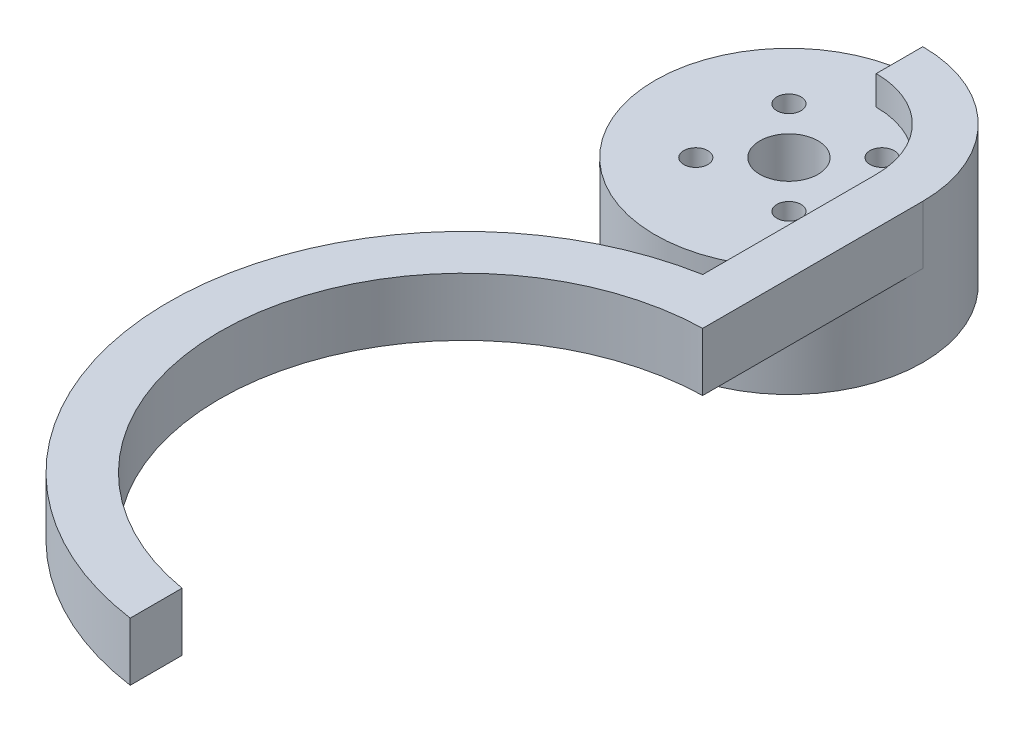
ISO-10303-21;
HEADER;
FILE_DESCRIPTION(('STEP AP214'),'2;1');
FILE_NAME('part.step','',(''),(''),'','','');
FILE_SCHEMA(('AUTOMOTIVE_DESIGN { 1 0 10303 214 1 1 1 1 }'));
ENDSEC;
DATA;
#1=APPLICATION_CONTEXT('core data for automotive mechanical design processes');
#2=APPLICATION_PROTOCOL_DEFINITION('international standard','automotive_design',2000,#1);
#3=PRODUCT_CONTEXT('',#1,'mechanical');
#4=PRODUCT('Part','Part','',(#3));
#5=PRODUCT_RELATED_PRODUCT_CATEGORY('part','',(#4));
#6=PRODUCT_DEFINITION_FORMATION('','',#4);
#7=PRODUCT_DEFINITION_CONTEXT('part definition',#1,'design');
#8=PRODUCT_DEFINITION('design','',#6,#7);
#9=PRODUCT_DEFINITION_SHAPE('','',#8);
#10=(LENGTH_UNIT() NAMED_UNIT(*) SI_UNIT(.MILLI.,.METRE.));
#11=(NAMED_UNIT(*) PLANE_ANGLE_UNIT() SI_UNIT($,.RADIAN.));
#12=(NAMED_UNIT(*) SI_UNIT($,.STERADIAN.) SOLID_ANGLE_UNIT());
#13=UNCERTAINTY_MEASURE_WITH_UNIT(LENGTH_MEASURE(1.E-05),#10,'distance_accuracy_value','');
#14=(GEOMETRIC_REPRESENTATION_CONTEXT(3) GLOBAL_UNCERTAINTY_ASSIGNED_CONTEXT((#13)) GLOBAL_UNIT_ASSIGNED_CONTEXT((#10,
#11,#12)) REPRESENTATION_CONTEXT('',''));
#15=CARTESIAN_POINT('',(0.,0.,0.));
#16=DIRECTION('',(0.,0.,1.));
#17=DIRECTION('',(1.,0.,0.));
#18=AXIS2_PLACEMENT_3D('',#15,#16,#17);
#19=CARTESIAN_POINT('',(0.,0.,0.));
#20=DIRECTION('',(0.,1.,0.));
#21=DIRECTION('',(0.,0.,-1.));
#22=AXIS2_PLACEMENT_3D('',#19,#20,#21);
#23=PLANE('',#22);
#24=CARTESIAN_POINT('',(0.,0.,0.));
#25=DIRECTION('',(0.,-1.,0.));
#26=DIRECTION('',(0.,0.,-1.));
#27=AXIS2_PLACEMENT_3D('',#24,#25,#26);
#28=CIRCLE('',#27,23.);
#29=CARTESIAN_POINT('',(23.,0.,0.));
#30=VERTEX_POINT('',#29);
#31=CARTESIAN_POINT('',(15.,0.,17.4355957741627));
#32=VERTEX_POINT('',#31);
#33=EDGE_CURVE('E114',#30,#32,#28,.T.);
#34=ORIENTED_EDGE('',*,*,#33,.F.);
#35=DIRECTION('',(0.,0.,1.));
#36=VECTOR('',#35,1.);
#37=CARTESIAN_POINT('',(23.,0.,0.));
#38=LINE('',#37,#36);
#39=CARTESIAN_POINT('',(23.,0.,37.811906449566));
#40=VERTEX_POINT('',#39);
#41=EDGE_CURVE('E123',#30,#40,#38,.T.);
#42=ORIENTED_EDGE('',*,*,#41,.T.);
#43=CARTESIAN_POINT('',(24.,0.,79.8));
#44=DIRECTION('',(0.,-1.,0.));
#45=DIRECTION('',(0.,0.,-1.));
#46=AXIS2_PLACEMENT_3D('',#43,#44,#45);
#47=CIRCLE('',#46,42.);
#48=CARTESIAN_POINT('',(16.9372197309417,0.,121.201897720648));
#49=VERTEX_POINT('',#48);
#50=EDGE_CURVE('E128',#49,#40,#47,.T.);
#51=ORIENTED_EDGE('',*,*,#50,.F.);
#52=DIRECTION('',(0.,0.,1.));
#53=VECTOR('',#52,1.);
#54=CARTESIAN_POINT('',(16.9372197309417,0.,0.));
#55=LINE('',#54,#53);
#56=CARTESIAN_POINT('',(16.9372197309417,0.,130.106631122259));
#57=VERTEX_POINT('',#56);
#58=EDGE_CURVE('E194',#49,#57,#55,.T.);
#59=ORIENTED_EDGE('',*,*,#58,.T.);
#60=CARTESIAN_POINT('',(24.,0.,79.8));
#61=DIRECTION('',(0.,-1.,0.));
#62=DIRECTION('',(0.,0.,-1.));
#63=AXIS2_PLACEMENT_3D('',#60,#61,#62);
#64=CIRCLE('',#63,50.8);
#65=CARTESIAN_POINT('',(15.,0.,29.8036001296093));
#66=VERTEX_POINT('',#65);
#67=EDGE_CURVE('E176',#57,#66,#64,.T.);
#68=ORIENTED_EDGE('',*,*,#67,.T.);
#69=DIRECTION('',(0.,0.,1.));
#70=VECTOR('',#69,1.);
#71=CARTESIAN_POINT('',(15.,0.,0.));
#72=LINE('',#71,#70);
#73=EDGE_CURVE('E129',#32,#66,#72,.T.);
#74=ORIENTED_EDGE('',*,*,#73,.F.);
#75=EDGE_LOOP('',(#34,#42,#51,#59,#68,#74));
#76=FACE_BOUND('',#75,.T.);
#77=ADVANCED_FACE('F37',(#76),#23,.F.);
#78=CARTESIAN_POINT('',(15.,5.,0.));
#79=DIRECTION('',(-1.,0.,0.));
#80=DIRECTION('',(0.,0.,-1.));
#81=AXIS2_PLACEMENT_3D('',#78,#79,#80);
#82=PLANE('',#81);
#83=ORIENTED_EDGE('',*,*,#73,.T.);
#84=DIRECTION('',(0.,-1.,0.));
#85=VECTOR('',#84,1.);
#86=CARTESIAN_POINT('',(15.,5.,29.8036001296093));
#87=LINE('',#86,#85);
#88=CARTESIAN_POINT('',(15.,10.,29.8036001296093));
#89=VERTEX_POINT('',#88);
#90=EDGE_CURVE('E191',#89,#66,#87,.T.);
#91=ORIENTED_EDGE('',*,*,#90,.F.);
#92=DIRECTION('',(0.,0.,1.));
#93=VECTOR('',#92,1.);
#94=CARTESIAN_POINT('',(15.,10.,0.));
#95=LINE('',#94,#93);
#96=CARTESIAN_POINT('',(15.,10.,0.));
#97=VERTEX_POINT('',#96);
#98=EDGE_CURVE('E150',#97,#89,#95,.T.);
#99=ORIENTED_EDGE('',*,*,#98,.F.);
#100=DIRECTION('',(0.,-1.,0.));
#101=VECTOR('',#100,1.);
#102=CARTESIAN_POINT('',(15.,10.,0.));
#103=LINE('',#102,#101);
#104=CARTESIAN_POINT('',(15.,5.,0.));
#105=VERTEX_POINT('',#104);
#106=EDGE_CURVE('E164',#97,#105,#103,.T.);
#107=ORIENTED_EDGE('',*,*,#106,.T.);
#108=DIRECTION('',(0.,0.,-1.));
#109=VECTOR('',#108,1.);
#110=CARTESIAN_POINT('',(15.,5.,0.));
#111=LINE('',#110,#109);
#112=CARTESIAN_POINT('',(15.,5.,17.4355957741627));
#113=VERTEX_POINT('',#112);
#114=EDGE_CURVE('E170',#113,#105,#111,.T.);
#115=ORIENTED_EDGE('',*,*,#114,.F.);
#116=DIRECTION('',(0.,-1.,0.));
#117=VECTOR('',#116,1.);
#118=CARTESIAN_POINT('',(15.,5.,17.4355957741627));
#119=LINE('',#118,#117);
#120=EDGE_CURVE('E11',#113,#32,#119,.T.);
#121=ORIENTED_EDGE('',*,*,#120,.T.);
#122=EDGE_LOOP('',(#83,#91,#99,#107,#115,#121));
#123=FACE_BOUND('',#122,.T.);
#124=ADVANCED_FACE('F39',(#123),#82,.T.);
#125=CARTESIAN_POINT('',(0.,5.,0.));
#126=DIRECTION('',(0.,-1.,0.));
#127=DIRECTION('',(0.,0.,1.));
#128=AXIS2_PLACEMENT_3D('',#125,#126,#127);
#129=CYLINDRICAL_SURFACE('',#128,23.);
#130=DIRECTION('',(0.,-1.,0.));
#131=VECTOR('',#130,1.);
#132=CARTESIAN_POINT('',(23.,5.,0.));
#133=LINE('',#132,#131);
#134=CARTESIAN_POINT('',(23.,10.,0.));
#135=VERTEX_POINT('',#134);
#136=EDGE_CURVE('E45',#135,#30,#133,.T.);
#137=ORIENTED_EDGE('',*,*,#136,.T.);
#138=ORIENTED_EDGE('',*,*,#33,.T.);
#139=ORIENTED_EDGE('',*,*,#120,.F.);
#140=CARTESIAN_POINT('',(0.,5.,0.));
#141=DIRECTION('',(0.,-1.,0.));
#142=DIRECTION('',(0.,0.,-1.));
#143=AXIS2_PLACEMENT_3D('',#140,#141,#142);
#144=CIRCLE('',#143,23.);
#145=CARTESIAN_POINT('',(0.,5.,-23.));
#146=VERTEX_POINT('',#145);
#147=EDGE_CURVE('E172',#113,#146,#144,.T.);
#148=ORIENTED_EDGE('',*,*,#147,.T.);
#149=DIRECTION('',(0.,-1.,0.));
#150=VECTOR('',#149,1.);
#151=CARTESIAN_POINT('',(0.,10.,-23.));
#152=LINE('',#151,#150);
#153=CARTESIAN_POINT('',(0.,10.,-23.));
#154=VERTEX_POINT('',#153);
#155=EDGE_CURVE('E160',#154,#146,#152,.T.);
#156=ORIENTED_EDGE('',*,*,#155,.F.);
#157=CARTESIAN_POINT('',(0.,10.,0.));
#158=DIRECTION('',(0.,-1.,0.));
#159=DIRECTION('',(0.,0.,-1.));
#160=AXIS2_PLACEMENT_3D('',#157,#158,#159);
#161=CIRCLE('',#160,23.);
#162=EDGE_CURVE('E117',#154,#135,#161,.T.);
#163=ORIENTED_EDGE('',*,*,#162,.T.);
#164=EDGE_LOOP('',(#137,#138,#139,#148,#156,#163));
#165=FACE_BOUND('',#164,.T.);
#166=CARTESIAN_POINT('',(0.,-14.,0.));
#167=DIRECTION('',(0.,-1.,0.));
#168=DIRECTION('',(0.,0.,-1.));
#169=AXIS2_PLACEMENT_3D('',#166,#167,#168);
#170=CIRCLE('',#169,23.);
#171=CARTESIAN_POINT('',(0.,-14.,-23.));
#172=VERTEX_POINT('',#171);
#173=EDGE_CURVE('E133',#172,#172,#170,.T.);
#174=ORIENTED_EDGE('',*,*,#173,.F.);
#175=EDGE_LOOP('',(#174));
#176=FACE_BOUND('',#175,.T.);
#177=ADVANCED_FACE('F110',(#165,#176),#129,.T.);
#178=CARTESIAN_POINT('',(23.,5.,0.));
#179=DIRECTION('',(-1.,0.,0.));
#180=DIRECTION('',(0.,0.,-1.));
#181=AXIS2_PLACEMENT_3D('',#178,#179,#180);
#182=PLANE('',#181);
#183=ORIENTED_EDGE('',*,*,#41,.F.);
#184=ORIENTED_EDGE('',*,*,#136,.F.);
#185=DIRECTION('',(0.,0.,1.));
#186=VECTOR('',#185,1.);
#187=CARTESIAN_POINT('',(23.,10.,0.));
#188=LINE('',#187,#186);
#189=CARTESIAN_POINT('',(23.,10.,37.811906449566));
#190=VERTEX_POINT('',#189);
#191=EDGE_CURVE('E158',#135,#190,#188,.T.);
#192=ORIENTED_EDGE('',*,*,#191,.T.);
#193=DIRECTION('',(0.,-1.,0.));
#194=VECTOR('',#193,1.);
#195=CARTESIAN_POINT('',(23.,5.,37.811906449566));
#196=LINE('',#195,#194);
#197=EDGE_CURVE('E120',#190,#40,#196,.T.);
#198=ORIENTED_EDGE('',*,*,#197,.T.);
#199=EDGE_LOOP('',(#183,#184,#192,#198));
#200=FACE_BOUND('',#199,.T.);
#201=ADVANCED_FACE('F124',(#200),#182,.F.);
#202=CARTESIAN_POINT('',(24.,5.,79.8));
#203=DIRECTION('',(0.,-1.,0.));
#204=DIRECTION('',(0.,0.,1.));
#205=AXIS2_PLACEMENT_3D('',#202,#203,#204);
#206=CYLINDRICAL_SURFACE('',#205,42.);
#207=ORIENTED_EDGE('',*,*,#50,.T.);
#208=ORIENTED_EDGE('',*,*,#197,.F.);
#209=CARTESIAN_POINT('',(24.,10.,79.8));
#210=DIRECTION('',(0.,-1.,0.));
#211=DIRECTION('',(0.,0.,-1.));
#212=AXIS2_PLACEMENT_3D('',#209,#210,#211);
#213=CIRCLE('',#212,42.);
#214=CARTESIAN_POINT('',(16.9372197309417,10.,121.201897720648));
#215=VERTEX_POINT('',#214);
#216=EDGE_CURVE('E143',#215,#190,#213,.T.);
#217=ORIENTED_EDGE('',*,*,#216,.F.);
#218=DIRECTION('',(0.,-1.,0.));
#219=VECTOR('',#218,1.);
#220=CARTESIAN_POINT('',(16.9372197309417,5.,121.201897720648));
#221=LINE('',#220,#219);
#222=EDGE_CURVE('E205',#215,#49,#221,.T.);
#223=ORIENTED_EDGE('',*,*,#222,.T.);
#224=EDGE_LOOP('',(#207,#208,#217,#223));
#225=FACE_BOUND('',#224,.T.);
#226=ADVANCED_FACE('F211',(#225),#206,.F.);
#227=CARTESIAN_POINT('',(16.9372197309417,5.,0.));
#228=DIRECTION('',(-1.,0.,0.));
#229=DIRECTION('',(0.,0.,-1.));
#230=AXIS2_PLACEMENT_3D('',#227,#228,#229);
#231=PLANE('',#230);
#232=ORIENTED_EDGE('',*,*,#58,.F.);
#233=ORIENTED_EDGE('',*,*,#222,.F.);
#234=DIRECTION('',(0.,0.,1.));
#235=VECTOR('',#234,1.);
#236=CARTESIAN_POINT('',(16.9372197309417,10.,0.));
#237=LINE('',#236,#235);
#238=CARTESIAN_POINT('',(16.9372197309417,10.,130.106631122259));
#239=VERTEX_POINT('',#238);
#240=EDGE_CURVE('E145',#215,#239,#237,.T.);
#241=ORIENTED_EDGE('',*,*,#240,.T.);
#242=DIRECTION('',(0.,-1.,0.));
#243=VECTOR('',#242,1.);
#244=CARTESIAN_POINT('',(16.9372197309417,5.,130.106631122259));
#245=LINE('',#244,#243);
#246=EDGE_CURVE('E202',#239,#57,#245,.T.);
#247=ORIENTED_EDGE('',*,*,#246,.T.);
#248=EDGE_LOOP('',(#232,#233,#241,#247));
#249=FACE_BOUND('',#248,.T.);
#250=ADVANCED_FACE('F213',(#249),#231,.F.);
#251=CARTESIAN_POINT('',(8.,5.,-8.));
#252=DIRECTION('',(0.,-1.,0.));
#253=DIRECTION('',(0.,0.,1.));
#254=AXIS2_PLACEMENT_3D('',#251,#252,#253);
#255=CYLINDRICAL_SURFACE('',#254,2.075);
#256=CARTESIAN_POINT('',(8.,5.,-8.));
#257=DIRECTION('',(0.,-1.,0.));
#258=DIRECTION('',(0.,0.,-1.));
#259=AXIS2_PLACEMENT_3D('',#256,#257,#258);
#260=CIRCLE('',#259,2.075);
#261=CARTESIAN_POINT('',(8.,5.,-10.075));
#262=VERTEX_POINT('',#261);
#263=EDGE_CURVE('E185',#262,#262,#260,.T.);
#264=ORIENTED_EDGE('',*,*,#263,.F.);
#265=EDGE_LOOP('',(#264));
#266=FACE_BOUND('',#265,.T.);
#267=CARTESIAN_POINT('',(8.,-14.,-8.));
#268=DIRECTION('',(0.,-1.,0.));
#269=DIRECTION('',(0.,0.,-1.));
#270=AXIS2_PLACEMENT_3D('',#267,#268,#269);
#271=CIRCLE('',#270,2.075);
#272=CARTESIAN_POINT('',(8.,-14.,-10.075));
#273=VERTEX_POINT('',#272);
#274=EDGE_CURVE('E490',#273,#273,#271,.T.);
#275=ORIENTED_EDGE('',*,*,#274,.T.);
#276=EDGE_LOOP('',(#275));
#277=FACE_BOUND('',#276,.T.);
#278=ADVANCED_FACE('F248',(#266,#277),#255,.F.);
#279=CARTESIAN_POINT('',(8.,5.,8.));
#280=DIRECTION('',(0.,-1.,0.));
#281=DIRECTION('',(0.,0.,1.));
#282=AXIS2_PLACEMENT_3D('',#279,#280,#281);
#283=CYLINDRICAL_SURFACE('',#282,2.075);
#284=CARTESIAN_POINT('',(8.,5.,8.));
#285=DIRECTION('',(0.,-1.,0.));
#286=DIRECTION('',(0.,0.,-1.));
#287=AXIS2_PLACEMENT_3D('',#284,#285,#286);
#288=CIRCLE('',#287,2.075);
#289=CARTESIAN_POINT('',(8.,5.,5.925));
#290=VERTEX_POINT('',#289);
#291=EDGE_CURVE('E182',#290,#290,#288,.T.);
#292=ORIENTED_EDGE('',*,*,#291,.F.);
#293=EDGE_LOOP('',(#292));
#294=FACE_BOUND('',#293,.T.);
#295=CARTESIAN_POINT('',(8.,0.,8.));
#296=DIRECTION('',(0.,-1.,0.));
#297=DIRECTION('',(0.,0.,-1.));
#298=AXIS2_PLACEMENT_3D('',#295,#296,#297);
#299=CIRCLE('',#298,2.075);
#300=CARTESIAN_POINT('',(8.,0.,5.925));
#301=VERTEX_POINT('',#300);
#302=EDGE_CURVE('E137',#301,#301,#299,.T.);
#303=ORIENTED_EDGE('',*,*,#302,.T.);
#304=EDGE_LOOP('',(#303));
#305=FACE_BOUND('',#304,.T.);
#306=ADVANCED_FACE('F251',(#294,#305),#283,.F.);
#307=CARTESIAN_POINT('',(-8.,5.,-8.));
#308=DIRECTION('',(0.,-1.,0.));
#309=DIRECTION('',(0.,0.,1.));
#310=AXIS2_PLACEMENT_3D('',#307,#308,#309);
#311=CYLINDRICAL_SURFACE('',#310,2.075);
#312=CARTESIAN_POINT('',(-8.,5.,-8.));
#313=DIRECTION('',(0.,-1.,0.));
#314=DIRECTION('',(0.,0.,-1.));
#315=AXIS2_PLACEMENT_3D('',#312,#313,#314);
#316=CIRCLE('',#315,2.075);
#317=CARTESIAN_POINT('',(-8.,5.,-10.075));
#318=VERTEX_POINT('',#317);
#319=EDGE_CURVE('E179',#318,#318,#316,.T.);
#320=ORIENTED_EDGE('',*,*,#319,.F.);
#321=EDGE_LOOP('',(#320));
#322=FACE_BOUND('',#321,.T.);
#323=CARTESIAN_POINT('',(-8.,-14.,-8.));
#324=DIRECTION('',(0.,-1.,0.));
#325=DIRECTION('',(0.,0.,-1.));
#326=AXIS2_PLACEMENT_3D('',#323,#324,#325);
#327=CIRCLE('',#326,2.075);
#328=CARTESIAN_POINT('',(-8.,-14.,-10.075));
#329=VERTEX_POINT('',#328);
#330=EDGE_CURVE('E495',#329,#329,#327,.T.);
#331=ORIENTED_EDGE('',*,*,#330,.T.);
#332=EDGE_LOOP('',(#331));
#333=FACE_BOUND('',#332,.T.);
#334=ADVANCED_FACE('F255',(#322,#333),#311,.F.);
#335=CARTESIAN_POINT('',(-8.,5.,8.));
#336=DIRECTION('',(0.,-1.,0.));
#337=DIRECTION('',(0.,0.,1.));
#338=AXIS2_PLACEMENT_3D('',#335,#336,#337);
#339=CYLINDRICAL_SURFACE('',#338,2.075);
#340=CARTESIAN_POINT('',(-8.,5.,8.));
#341=DIRECTION('',(0.,-1.,0.));
#342=DIRECTION('',(0.,0.,-1.));
#343=AXIS2_PLACEMENT_3D('',#340,#341,#342);
#344=CIRCLE('',#343,2.075);
#345=CARTESIAN_POINT('',(-8.,5.,5.925));
#346=VERTEX_POINT('',#345);
#347=EDGE_CURVE('E175',#346,#346,#344,.T.);
#348=ORIENTED_EDGE('',*,*,#347,.F.);
#349=EDGE_LOOP('',(#348));
#350=FACE_BOUND('',#349,.T.);
#351=CARTESIAN_POINT('',(-8.,-14.,8.));
#352=DIRECTION('',(0.,-1.,0.));
#353=DIRECTION('',(0.,0.,-1.));
#354=AXIS2_PLACEMENT_3D('',#351,#352,#353);
#355=CIRCLE('',#354,2.075);
#356=CARTESIAN_POINT('',(-8.,-14.,5.925));
#357=VERTEX_POINT('',#356);
#358=EDGE_CURVE('E134',#357,#357,#355,.T.);
#359=ORIENTED_EDGE('',*,*,#358,.T.);
#360=EDGE_LOOP('',(#359));
#361=FACE_BOUND('',#360,.T.);
#362=ADVANCED_FACE('F259',(#350,#361),#339,.F.);
#363=CARTESIAN_POINT('',(24.,5.,79.8));
#364=DIRECTION('',(0.,-1.,0.));
#365=DIRECTION('',(0.,0.,1.));
#366=AXIS2_PLACEMENT_3D('',#363,#364,#365);
#367=CYLINDRICAL_SURFACE('',#366,50.8);
#368=ORIENTED_EDGE('',*,*,#67,.F.);
#369=ORIENTED_EDGE('',*,*,#246,.F.);
#370=CARTESIAN_POINT('',(24.,10.,79.8));
#371=DIRECTION('',(0.,-1.,0.));
#372=DIRECTION('',(0.,0.,-1.));
#373=AXIS2_PLACEMENT_3D('',#370,#371,#372);
#374=CIRCLE('',#373,50.8);
#375=EDGE_CURVE('E148',#239,#89,#374,.T.);
#376=ORIENTED_EDGE('',*,*,#375,.T.);
#377=ORIENTED_EDGE('',*,*,#90,.T.);
#378=EDGE_LOOP('',(#368,#369,#376,#377));
#379=FACE_BOUND('',#378,.T.);
#380=ADVANCED_FACE('F216',(#379),#367,.T.);
#381=CARTESIAN_POINT('',(0.,5.,0.));
#382=DIRECTION('',(0.,-1.,0.));
#383=DIRECTION('',(0.,0.,1.));
#384=AXIS2_PLACEMENT_3D('',#381,#382,#383);
#385=CYLINDRICAL_SURFACE('',#384,5.);
#386=CARTESIAN_POINT('',(0.,5.,0.));
#387=DIRECTION('',(0.,-1.,0.));
#388=DIRECTION('',(0.,0.,-1.));
#389=AXIS2_PLACEMENT_3D('',#386,#387,#388);
#390=CIRCLE('',#389,5.);
#391=CARTESIAN_POINT('',(0.,5.,-5.));
#392=VERTEX_POINT('',#391);
#393=EDGE_CURVE('E188',#392,#392,#390,.T.);
#394=ORIENTED_EDGE('',*,*,#393,.F.);
#395=EDGE_LOOP('',(#394));
#396=FACE_BOUND('',#395,.T.);
#397=CARTESIAN_POINT('',(0.,-14.,0.));
#398=DIRECTION('',(0.,-1.,0.));
#399=DIRECTION('',(0.,0.,-1.));
#400=AXIS2_PLACEMENT_3D('',#397,#398,#399);
#401=CIRCLE('',#400,5.);
#402=CARTESIAN_POINT('',(0.,-14.,-5.));
#403=VERTEX_POINT('',#402);
#404=EDGE_CURVE('E486',#403,#403,#401,.T.);
#405=ORIENTED_EDGE('',*,*,#404,.T.);
#406=EDGE_LOOP('',(#405));
#407=FACE_BOUND('',#406,.T.);
#408=ADVANCED_FACE('F236',(#396,#407),#385,.F.);
#409=CARTESIAN_POINT('',(0.,5.,0.));
#410=DIRECTION('',(0.,1.,0.));
#411=DIRECTION('',(0.,0.,-1.));
#412=AXIS2_PLACEMENT_3D('',#409,#410,#411);
#413=PLANE('',#412);
#414=ORIENTED_EDGE('',*,*,#114,.T.);
#415=CARTESIAN_POINT('',(0.,5.,0.));
#416=DIRECTION('',(0.,-1.,0.));
#417=DIRECTION('',(0.,0.,-1.));
#418=AXIS2_PLACEMENT_3D('',#415,#416,#417);
#419=CIRCLE('',#418,15.);
#420=CARTESIAN_POINT('',(0.,5.,-15.));
#421=VERTEX_POINT('',#420);
#422=EDGE_CURVE('E52',#105,#421,#419,.F.);
#423=ORIENTED_EDGE('',*,*,#422,.T.);
#424=DIRECTION('',(0.,0.,1.));
#425=VECTOR('',#424,1.);
#426=CARTESIAN_POINT('',(0.,5.,0.));
#427=LINE('',#426,#425);
#428=EDGE_CURVE('E167',#146,#421,#427,.T.);
#429=ORIENTED_EDGE('',*,*,#428,.F.);
#430=ORIENTED_EDGE('',*,*,#147,.F.);
#431=EDGE_LOOP('',(#414,#423,#429,#430));
#432=FACE_BOUND('',#431,.T.);
#433=ORIENTED_EDGE('',*,*,#347,.T.);
#434=EDGE_LOOP('',(#433));
#435=FACE_BOUND('',#434,.T.);
#436=ORIENTED_EDGE('',*,*,#319,.T.);
#437=EDGE_LOOP('',(#436));
#438=FACE_BOUND('',#437,.T.);
#439=ORIENTED_EDGE('',*,*,#291,.T.);
#440=EDGE_LOOP('',(#439));
#441=FACE_BOUND('',#440,.T.);
#442=ORIENTED_EDGE('',*,*,#263,.T.);
#443=EDGE_LOOP('',(#442));
#444=FACE_BOUND('',#443,.T.);
#445=ORIENTED_EDGE('',*,*,#393,.T.);
#446=EDGE_LOOP('',(#445));
#447=FACE_BOUND('',#446,.T.);
#448=ADVANCED_FACE('F222',(#432,#435,#438,#441,#444,#447),#413,.T.);
#449=CARTESIAN_POINT('',(0.,10.,0.));
#450=DIRECTION('',(0.,-1.,0.));
#451=DIRECTION('',(0.,0.,1.));
#452=AXIS2_PLACEMENT_3D('',#449,#450,#451);
#453=CYLINDRICAL_SURFACE('',#452,15.);
#454=ORIENTED_EDGE('',*,*,#106,.F.);
#455=CARTESIAN_POINT('',(0.,10.,0.));
#456=DIRECTION('',(0.,-1.,0.));
#457=DIRECTION('',(0.,0.,-1.));
#458=AXIS2_PLACEMENT_3D('',#455,#456,#457);
#459=CIRCLE('',#458,15.);
#460=CARTESIAN_POINT('',(0.,10.,-15.));
#461=VERTEX_POINT('',#460);
#462=EDGE_CURVE('E153',#461,#97,#459,.T.);
#463=ORIENTED_EDGE('',*,*,#462,.F.);
#464=DIRECTION('',(0.,-1.,0.));
#465=VECTOR('',#464,1.);
#466=CARTESIAN_POINT('',(0.,10.,-15.));
#467=LINE('',#466,#465);
#468=EDGE_CURVE('E57',#461,#421,#467,.T.);
#469=ORIENTED_EDGE('',*,*,#468,.T.);
#470=ORIENTED_EDGE('',*,*,#422,.F.);
#471=EDGE_LOOP('',(#454,#463,#469,#470));
#472=FACE_BOUND('',#471,.T.);
#473=ADVANCED_FACE('F228',(#472),#453,.F.);
#474=CARTESIAN_POINT('',(0.,10.,0.));
#475=DIRECTION('',(1.,0.,0.));
#476=DIRECTION('',(0.,0.,1.));
#477=AXIS2_PLACEMENT_3D('',#474,#475,#476);
#478=PLANE('',#477);
#479=ORIENTED_EDGE('',*,*,#428,.T.);
#480=ORIENTED_EDGE('',*,*,#468,.F.);
#481=DIRECTION('',(0.,0.,-1.));
#482=VECTOR('',#481,1.);
#483=CARTESIAN_POINT('',(0.,10.,0.));
#484=LINE('',#483,#482);
#485=EDGE_CURVE('E155',#461,#154,#484,.T.);
#486=ORIENTED_EDGE('',*,*,#485,.T.);
#487=ORIENTED_EDGE('',*,*,#155,.T.);
#488=EDGE_LOOP('',(#479,#480,#486,#487));
#489=FACE_BOUND('',#488,.T.);
#490=ADVANCED_FACE('F225',(#489),#478,.F.);
#491=CARTESIAN_POINT('',(0.,10.,0.));
#492=DIRECTION('',(0.,1.,0.));
#493=DIRECTION('',(0.,0.,-1.));
#494=AXIS2_PLACEMENT_3D('',#491,#492,#493);
#495=PLANE('',#494);
#496=ORIENTED_EDGE('',*,*,#216,.T.);
#497=ORIENTED_EDGE('',*,*,#191,.F.);
#498=ORIENTED_EDGE('',*,*,#162,.F.);
#499=ORIENTED_EDGE('',*,*,#485,.F.);
#500=ORIENTED_EDGE('',*,*,#462,.T.);
#501=ORIENTED_EDGE('',*,*,#98,.T.);
#502=ORIENTED_EDGE('',*,*,#375,.F.);
#503=ORIENTED_EDGE('',*,*,#240,.F.);
#504=EDGE_LOOP('',(#496,#497,#498,#499,#500,#501,#502,#503));
#505=FACE_BOUND('',#504,.T.);
#506=ADVANCED_FACE('F227',(#505),#495,.T.);
#507=CARTESIAN_POINT('',(0.,-14.,0.));
#508=DIRECTION('',(0.,-1.,0.));
#509=DIRECTION('',(0.,0.,-1.));
#510=AXIS2_PLACEMENT_3D('',#507,#508,#509);
#511=PLANE('',#510);
#512=ORIENTED_EDGE('',*,*,#274,.F.);
#513=EDGE_LOOP('',(#512));
#514=FACE_BOUND('',#513,.T.);
#515=CARTESIAN_POINT('',(8.,-14.,8.));
#516=DIRECTION('',(0.,-1.,0.));
#517=DIRECTION('',(0.,0.,-1.));
#518=AXIS2_PLACEMENT_3D('',#515,#516,#517);
#519=CIRCLE('',#518,2.01845818826009);
#520=CARTESIAN_POINT('',(8.,-14.,5.98154181173991));
#521=VERTEX_POINT('',#520);
#522=EDGE_CURVE('E140',#521,#521,#519,.T.);
#523=ORIENTED_EDGE('',*,*,#522,.F.);
#524=EDGE_LOOP('',(#523));
#525=FACE_BOUND('',#524,.T.);
#526=ORIENTED_EDGE('',*,*,#173,.T.);
#527=EDGE_LOOP('',(#526));
#528=FACE_BOUND('',#527,.T.);
#529=ORIENTED_EDGE('',*,*,#358,.F.);
#530=EDGE_LOOP('',(#529));
#531=FACE_BOUND('',#530,.T.);
#532=ORIENTED_EDGE('',*,*,#404,.F.);
#533=EDGE_LOOP('',(#532));
#534=FACE_BOUND('',#533,.T.);
#535=ORIENTED_EDGE('',*,*,#330,.F.);
#536=EDGE_LOOP('',(#535));
#537=FACE_BOUND('',#536,.T.);
#538=ADVANCED_FACE('F298',(#514,#525,#528,#531,#534,#537),#511,.T.);
#539=CARTESIAN_POINT('',(0.,0.,0.));
#540=DIRECTION('',(0.,-1.,0.));
#541=DIRECTION('',(0.,0.,-1.));
#542=AXIS2_PLACEMENT_3D('',#539,#540,#541);
#543=PLANE('',#542);
#544=ORIENTED_EDGE('',*,*,#302,.F.);
#545=EDGE_LOOP('',(#544));
#546=FACE_BOUND('',#545,.T.);
#547=CARTESIAN_POINT('',(8.,0.,8.));
#548=DIRECTION('',(0.,-1.,0.));
#549=DIRECTION('',(0.,0.,-1.));
#550=AXIS2_PLACEMENT_3D('',#547,#548,#549);
#551=CIRCLE('',#550,2.01845818826009);
#552=CARTESIAN_POINT('',(8.,0.,5.98154181173991));
#553=VERTEX_POINT('',#552);
#554=EDGE_CURVE('E484',#553,#553,#551,.T.);
#555=ORIENTED_EDGE('',*,*,#554,.T.);
#556=EDGE_LOOP('',(#555));
#557=FACE_BOUND('',#556,.T.);
#558=ADVANCED_FACE('F301',(#546,#557),#543,.F.);
#559=CARTESIAN_POINT('',(8.,-14.,8.));
#560=DIRECTION('',(0.,1.,0.));
#561=DIRECTION('',(0.,0.,1.));
#562=AXIS2_PLACEMENT_3D('',#559,#560,#561);
#563=CYLINDRICAL_SURFACE('',#562,2.01845818826009);
#564=ORIENTED_EDGE('',*,*,#522,.T.);
#565=EDGE_LOOP('',(#564));
#566=FACE_BOUND('',#565,.T.);
#567=ORIENTED_EDGE('',*,*,#554,.F.);
#568=EDGE_LOOP('',(#567));
#569=FACE_BOUND('',#568,.T.);
#570=ADVANCED_FACE('F309',(#566,#569),#563,.F.);
#571=CLOSED_SHELL('',(#77,#124,#177,#201,#226,#250,#278,#306,#334,#362,#380,#408,#448,#473,#490,
#506,#538,#558,#570));
#572=MANIFOLD_SOLID_BREP('B2',#571);
#573=ADVANCED_BREP_SHAPE_REPRESENTATION('',(#18,#572),#14);
#574=SHAPE_DEFINITION_REPRESENTATION(#9,#573);
ENDSEC;
END-ISO-10303-21;
